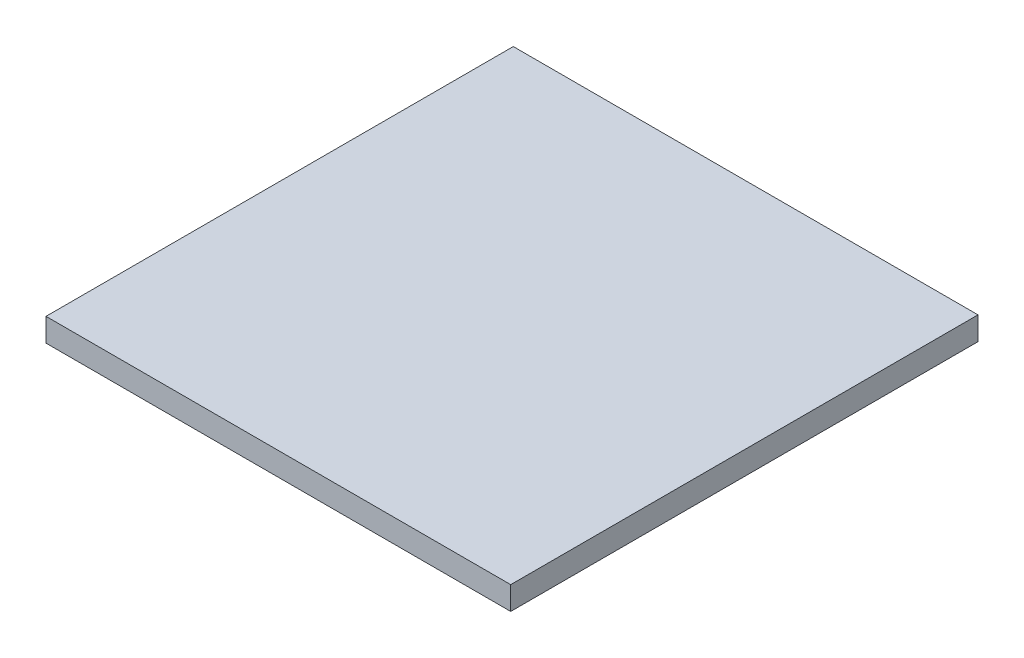
ISO-10303-21;
HEADER;
FILE_DESCRIPTION(('STEP AP214'),'2;1');
FILE_NAME('part.step','',(''),(''),'','','');
FILE_SCHEMA(('AUTOMOTIVE_DESIGN { 1 0 10303 214 1 1 1 1 }'));
ENDSEC;
DATA;
#1=APPLICATION_CONTEXT('core data for automotive mechanical design processes');
#2=APPLICATION_PROTOCOL_DEFINITION('international standard','automotive_design',2000,#1);
#3=PRODUCT_CONTEXT('',#1,'mechanical');
#4=PRODUCT('Part','Part','',(#3));
#5=PRODUCT_RELATED_PRODUCT_CATEGORY('part','',(#4));
#6=PRODUCT_DEFINITION_FORMATION('','',#4);
#7=PRODUCT_DEFINITION_CONTEXT('part definition',#1,'design');
#8=PRODUCT_DEFINITION('design','',#6,#7);
#9=PRODUCT_DEFINITION_SHAPE('','',#8);
#10=(LENGTH_UNIT() NAMED_UNIT(*) SI_UNIT(.MILLI.,.METRE.));
#11=(NAMED_UNIT(*) PLANE_ANGLE_UNIT() SI_UNIT($,.RADIAN.));
#12=(NAMED_UNIT(*) SI_UNIT($,.STERADIAN.) SOLID_ANGLE_UNIT());
#13=UNCERTAINTY_MEASURE_WITH_UNIT(LENGTH_MEASURE(1.E-05),#10,'distance_accuracy_value','');
#14=(GEOMETRIC_REPRESENTATION_CONTEXT(3) GLOBAL_UNCERTAINTY_ASSIGNED_CONTEXT((#13)) GLOBAL_UNIT_ASSIGNED_CONTEXT((#10,
#11,#12)) REPRESENTATION_CONTEXT('',''));
#15=CARTESIAN_POINT('',(0.,0.,0.));
#16=DIRECTION('',(0.,0.,1.));
#17=DIRECTION('',(1.,0.,0.));
#18=AXIS2_PLACEMENT_3D('',#15,#16,#17);
#19=CARTESIAN_POINT('',(180.,18.,-181.));
#20=DIRECTION('',(-1.,0.,0.));
#21=DIRECTION('',(0.,0.,1.));
#22=AXIS2_PLACEMENT_3D('',#19,#20,#21);
#23=PLANE('',#22);
#24=DIRECTION('',(0.,0.,-1.));
#25=VECTOR('',#24,1.);
#26=CARTESIAN_POINT('',(180.,0.,-181.));
#27=LINE('',#26,#25);
#28=CARTESIAN_POINT('',(180.,0.,181.));
#29=VERTEX_POINT('',#28);
#30=CARTESIAN_POINT('',(180.,0.,-181.));
#31=VERTEX_POINT('',#30);
#32=EDGE_CURVE('E97',#29,#31,#27,.T.);
#33=ORIENTED_EDGE('',*,*,#32,.T.);
#34=DIRECTION('',(0.,-1.,0.));
#35=VECTOR('',#34,1.);
#36=CARTESIAN_POINT('',(180.,18.,-181.));
#37=LINE('',#36,#35);
#38=CARTESIAN_POINT('',(180.,18.,-181.));
#39=VERTEX_POINT('',#38);
#40=EDGE_CURVE('E11',#39,#31,#37,.T.);
#41=ORIENTED_EDGE('',*,*,#40,.F.);
#42=DIRECTION('',(0.,0.,-1.));
#43=VECTOR('',#42,1.);
#44=CARTESIAN_POINT('',(180.,18.,-181.));
#45=LINE('',#44,#43);
#46=CARTESIAN_POINT('',(180.,18.,181.));
#47=VERTEX_POINT('',#46);
#48=EDGE_CURVE('E85',#47,#39,#45,.T.);
#49=ORIENTED_EDGE('',*,*,#48,.F.);
#50=DIRECTION('',(0.,-1.,0.));
#51=VECTOR('',#50,1.);
#52=CARTESIAN_POINT('',(180.,18.,181.));
#53=LINE('',#52,#51);
#54=EDGE_CURVE('E93',#47,#29,#53,.T.);
#55=ORIENTED_EDGE('',*,*,#54,.T.);
#56=EDGE_LOOP('',(#33,#41,#49,#55));
#57=FACE_BOUND('',#56,.T.);
#58=ADVANCED_FACE('F34',(#57),#23,.F.);
#59=CARTESIAN_POINT('',(-180.,18.,-181.));
#60=DIRECTION('',(0.,0.,1.));
#61=DIRECTION('',(1.,0.,0.));
#62=AXIS2_PLACEMENT_3D('',#59,#60,#61);
#63=PLANE('',#62);
#64=DIRECTION('',(-1.,0.,0.));
#65=VECTOR('',#64,1.);
#66=CARTESIAN_POINT('',(-180.,0.,-181.));
#67=LINE('',#66,#65);
#68=CARTESIAN_POINT('',(-180.,0.,-181.));
#69=VERTEX_POINT('',#68);
#70=EDGE_CURVE('E89',#31,#69,#67,.T.);
#71=ORIENTED_EDGE('',*,*,#70,.T.);
#72=DIRECTION('',(0.,-1.,0.));
#73=VECTOR('',#72,1.);
#74=CARTESIAN_POINT('',(-180.,18.,-181.));
#75=LINE('',#74,#73);
#76=CARTESIAN_POINT('',(-180.,18.,-181.));
#77=VERTEX_POINT('',#76);
#78=EDGE_CURVE('E42',#77,#69,#75,.T.);
#79=ORIENTED_EDGE('',*,*,#78,.F.);
#80=DIRECTION('',(-1.,0.,0.));
#81=VECTOR('',#80,1.);
#82=CARTESIAN_POINT('',(-180.,18.,-181.));
#83=LINE('',#82,#81);
#84=EDGE_CURVE('E80',#39,#77,#83,.T.);
#85=ORIENTED_EDGE('',*,*,#84,.F.);
#86=ORIENTED_EDGE('',*,*,#40,.T.);
#87=EDGE_LOOP('',(#71,#79,#85,#86));
#88=FACE_BOUND('',#87,.T.);
#89=ADVANCED_FACE('F88',(#88),#63,.F.);
#90=CARTESIAN_POINT('',(-180.,18.,-181.));
#91=DIRECTION('',(1.,0.,0.));
#92=DIRECTION('',(0.,0.,-1.));
#93=AXIS2_PLACEMENT_3D('',#90,#91,#92);
#94=PLANE('',#93);
#95=DIRECTION('',(0.,0.,1.));
#96=VECTOR('',#95,1.);
#97=CARTESIAN_POINT('',(-180.,0.,-181.));
#98=LINE('',#97,#96);
#99=CARTESIAN_POINT('',(-180.,0.,181.));
#100=VERTEX_POINT('',#99);
#101=EDGE_CURVE('E67',#69,#100,#98,.T.);
#102=ORIENTED_EDGE('',*,*,#101,.T.);
#103=DIRECTION('',(0.,-1.,0.));
#104=VECTOR('',#103,1.);
#105=CARTESIAN_POINT('',(-180.,18.,181.));
#106=LINE('',#105,#104);
#107=CARTESIAN_POINT('',(-180.,18.,181.));
#108=VERTEX_POINT('',#107);
#109=EDGE_CURVE('E90',#108,#100,#106,.T.);
#110=ORIENTED_EDGE('',*,*,#109,.F.);
#111=DIRECTION('',(0.,0.,1.));
#112=VECTOR('',#111,1.);
#113=CARTESIAN_POINT('',(-180.,18.,-181.));
#114=LINE('',#113,#112);
#115=EDGE_CURVE('E83',#77,#108,#114,.T.);
#116=ORIENTED_EDGE('',*,*,#115,.F.);
#117=ORIENTED_EDGE('',*,*,#78,.T.);
#118=EDGE_LOOP('',(#102,#110,#116,#117));
#119=FACE_BOUND('',#118,.T.);
#120=ADVANCED_FACE('F91',(#119),#94,.F.);
#121=CARTESIAN_POINT('',(-180.,18.,181.));
#122=DIRECTION('',(0.,0.,-1.));
#123=DIRECTION('',(-1.,0.,0.));
#124=AXIS2_PLACEMENT_3D('',#121,#122,#123);
#125=PLANE('',#124);
#126=DIRECTION('',(1.,0.,0.));
#127=VECTOR('',#126,1.);
#128=CARTESIAN_POINT('',(-180.,0.,181.));
#129=LINE('',#128,#127);
#130=EDGE_CURVE('E73',#100,#29,#129,.T.);
#131=ORIENTED_EDGE('',*,*,#130,.T.);
#132=ORIENTED_EDGE('',*,*,#54,.F.);
#133=DIRECTION('',(1.,0.,0.));
#134=VECTOR('',#133,1.);
#135=CARTESIAN_POINT('',(-180.,18.,181.));
#136=LINE('',#135,#134);
#137=EDGE_CURVE('E50',#108,#47,#136,.T.);
#138=ORIENTED_EDGE('',*,*,#137,.F.);
#139=ORIENTED_EDGE('',*,*,#109,.T.);
#140=EDGE_LOOP('',(#131,#132,#138,#139));
#141=FACE_BOUND('',#140,.T.);
#142=ADVANCED_FACE('F104',(#141),#125,.F.);
#143=CARTESIAN_POINT('',(0.,18.,0.));
#144=DIRECTION('',(0.,1.,0.));
#145=DIRECTION('',(0.,0.,1.));
#146=AXIS2_PLACEMENT_3D('',#143,#144,#145);
#147=PLANE('',#146);
#148=ORIENTED_EDGE('',*,*,#48,.T.);
#149=ORIENTED_EDGE('',*,*,#84,.T.);
#150=ORIENTED_EDGE('',*,*,#115,.T.);
#151=ORIENTED_EDGE('',*,*,#137,.T.);
#152=EDGE_LOOP('',(#148,#149,#150,#151));
#153=FACE_BOUND('',#152,.T.);
#154=ADVANCED_FACE('F81',(#153),#147,.T.);
#155=CARTESIAN_POINT('',(0.,0.,0.));
#156=DIRECTION('',(0.,1.,0.));
#157=DIRECTION('',(0.,0.,1.));
#158=AXIS2_PLACEMENT_3D('',#155,#156,#157);
#159=PLANE('',#158);
#160=ORIENTED_EDGE('',*,*,#32,.F.);
#161=ORIENTED_EDGE('',*,*,#130,.F.);
#162=ORIENTED_EDGE('',*,*,#101,.F.);
#163=ORIENTED_EDGE('',*,*,#70,.F.);
#164=EDGE_LOOP('',(#160,#161,#162,#163));
#165=FACE_BOUND('',#164,.T.);
#166=ADVANCED_FACE('F107',(#165),#159,.F.);
#167=CLOSED_SHELL('',(#58,#89,#120,#142,#154,#166));
#168=MANIFOLD_SOLID_BREP('B2',#167);
#169=ADVANCED_BREP_SHAPE_REPRESENTATION('',(#18,#168),#14);
#170=SHAPE_DEFINITION_REPRESENTATION(#9,#169);
ENDSEC;
END-ISO-10303-21;
